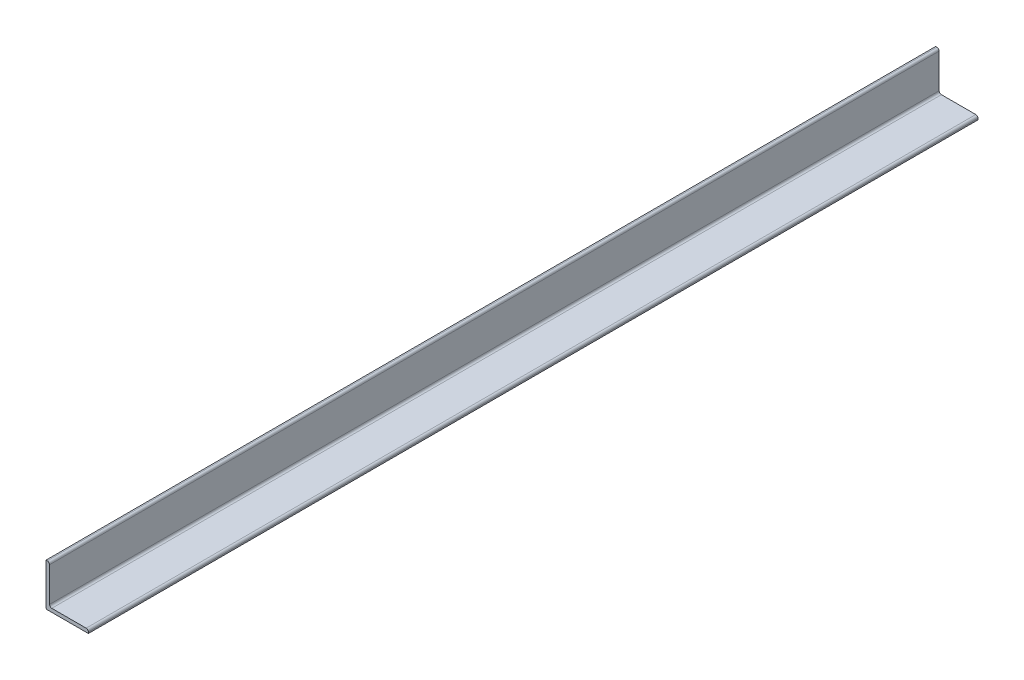
ISO-10303-21;
HEADER;
FILE_DESCRIPTION(('STEP AP214'),'2;1');
FILE_NAME('part.step','',(''),(''),'','','');
FILE_SCHEMA(('AUTOMOTIVE_DESIGN { 1 0 10303 214 1 1 1 1 }'));
ENDSEC;
DATA;
#1=APPLICATION_CONTEXT('core data for automotive mechanical design processes');
#2=APPLICATION_PROTOCOL_DEFINITION('international standard','automotive_design',2000,#1);
#3=PRODUCT_CONTEXT('',#1,'mechanical');
#4=PRODUCT('Part','Part','',(#3));
#5=PRODUCT_RELATED_PRODUCT_CATEGORY('part','',(#4));
#6=PRODUCT_DEFINITION_FORMATION('','',#4);
#7=PRODUCT_DEFINITION_CONTEXT('part definition',#1,'design');
#8=PRODUCT_DEFINITION('design','',#6,#7);
#9=PRODUCT_DEFINITION_SHAPE('','',#8);
#10=(LENGTH_UNIT() NAMED_UNIT(*) SI_UNIT(.MILLI.,.METRE.));
#11=(NAMED_UNIT(*) PLANE_ANGLE_UNIT() SI_UNIT($,.RADIAN.));
#12=(NAMED_UNIT(*) SI_UNIT($,.STERADIAN.) SOLID_ANGLE_UNIT());
#13=UNCERTAINTY_MEASURE_WITH_UNIT(LENGTH_MEASURE(1.E-05),#10,'distance_accuracy_value','');
#14=(GEOMETRIC_REPRESENTATION_CONTEXT(3) GLOBAL_UNCERTAINTY_ASSIGNED_CONTEXT((#13)) GLOBAL_UNIT_ASSIGNED_CONTEXT((#10,
#11,#12)) REPRESENTATION_CONTEXT('',''));
#15=CARTESIAN_POINT('',(0.,0.,0.));
#16=DIRECTION('',(0.,0.,1.));
#17=DIRECTION('',(1.,0.,0.));
#18=AXIS2_PLACEMENT_3D('',#15,#16,#17);
#19=CARTESIAN_POINT('',(19.05,0.,400.));
#20=DIRECTION('',(0.,1.,0.));
#21=DIRECTION('',(-1.,0.,0.));
#22=AXIS2_PLACEMENT_3D('',#19,#20,#21);
#23=PLANE('',#22);
#24=DIRECTION('',(1.,0.,0.));
#25=VECTOR('',#24,1.);
#26=CARTESIAN_POINT('',(19.05,0.,400.));
#27=LINE('',#26,#25);
#28=CARTESIAN_POINT('',(0.500000000000011,0.,400.));
#29=VERTEX_POINT('',#28);
#30=CARTESIAN_POINT('',(19.05,0.,400.));
#31=VERTEX_POINT('',#30);
#32=EDGE_CURVE('E109',#29,#31,#27,.T.);
#33=ORIENTED_EDGE('',*,*,#32,.F.);
#34=DIRECTION('',(0.,0.,-1.));
#35=VECTOR('',#34,1.);
#36=CARTESIAN_POINT('',(0.500000000000004,0.,400.));
#37=LINE('',#36,#35);
#38=CARTESIAN_POINT('',(0.500000000000011,0.,0.));
#39=VERTEX_POINT('',#38);
#40=EDGE_CURVE('E165',#29,#39,#37,.T.);
#41=ORIENTED_EDGE('',*,*,#40,.T.);
#42=DIRECTION('',(1.,0.,0.));
#43=VECTOR('',#42,1.);
#44=CARTESIAN_POINT('',(19.05,0.,0.));
#45=LINE('',#44,#43);
#46=CARTESIAN_POINT('',(19.05,0.,0.));
#47=VERTEX_POINT('',#46);
#48=EDGE_CURVE('E130',#39,#47,#45,.T.);
#49=ORIENTED_EDGE('',*,*,#48,.T.);
#50=DIRECTION('',(0.,0.,-1.));
#51=VECTOR('',#50,1.);
#52=CARTESIAN_POINT('',(19.05,0.,400.));
#53=LINE('',#52,#51);
#54=EDGE_CURVE('E125',#31,#47,#53,.T.);
#55=ORIENTED_EDGE('',*,*,#54,.F.);
#56=EDGE_LOOP('',(#33,#41,#49,#55));
#57=FACE_BOUND('',#56,.T.);
#58=ADVANCED_FACE('F32',(#57),#23,.F.);
#59=CARTESIAN_POINT('',(19.05,1.5875,400.));
#60=DIRECTION('',(-1.,0.,0.));
#61=DIRECTION('',(0.,0.,1.));
#62=AXIS2_PLACEMENT_3D('',#59,#60,#61);
#63=PLANE('',#62);
#64=DIRECTION('',(0.,1.,0.));
#65=VECTOR('',#64,1.);
#66=CARTESIAN_POINT('',(19.05,1.5875,0.));
#67=LINE('',#66,#65);
#68=CARTESIAN_POINT('',(19.05,0.5875,0.));
#69=VERTEX_POINT('',#68);
#70=EDGE_CURVE('E169',#47,#69,#67,.T.);
#71=ORIENTED_EDGE('',*,*,#70,.T.);
#72=DIRECTION('',(0.,0.,-1.));
#73=VECTOR('',#72,1.);
#74=CARTESIAN_POINT('',(19.05,0.5875,400.));
#75=LINE('',#74,#73);
#76=CARTESIAN_POINT('',(19.05,0.5875,400.));
#77=VERTEX_POINT('',#76);
#78=EDGE_CURVE('E127',#69,#77,#75,.F.);
#79=ORIENTED_EDGE('',*,*,#78,.T.);
#80=DIRECTION('',(0.,1.,0.));
#81=VECTOR('',#80,1.);
#82=CARTESIAN_POINT('',(19.05,1.5875,400.));
#83=LINE('',#82,#81);
#84=EDGE_CURVE('E112',#31,#77,#83,.T.);
#85=ORIENTED_EDGE('',*,*,#84,.F.);
#86=ORIENTED_EDGE('',*,*,#54,.T.);
#87=EDGE_LOOP('',(#71,#79,#85,#86));
#88=FACE_BOUND('',#87,.T.);
#89=ADVANCED_FACE('F124',(#88),#63,.F.);
#90=CARTESIAN_POINT('',(1.5875,1.5875,400.));
#91=DIRECTION('',(0.,-1.,0.));
#92=DIRECTION('',(0.,0.,-1.));
#93=AXIS2_PLACEMENT_3D('',#90,#91,#92);
#94=PLANE('',#93);
#95=DIRECTION('',(-1.,0.,0.));
#96=VECTOR('',#95,1.);
#97=CARTESIAN_POINT('',(1.5875,1.5875,400.));
#98=LINE('',#97,#96);
#99=CARTESIAN_POINT('',(18.05,1.5875,400.));
#100=VERTEX_POINT('',#99);
#101=CARTESIAN_POINT('',(2.5875,1.5875,400.));
#102=VERTEX_POINT('',#101);
#103=EDGE_CURVE('E128',#100,#102,#98,.T.);
#104=ORIENTED_EDGE('',*,*,#103,.F.);
#105=DIRECTION('',(0.,0.,-1.));
#106=VECTOR('',#105,1.);
#107=CARTESIAN_POINT('',(18.05,1.5875,400.));
#108=LINE('',#107,#106);
#109=CARTESIAN_POINT('',(18.05,1.5875,0.));
#110=VERTEX_POINT('',#109);
#111=EDGE_CURVE('E135',#100,#110,#108,.T.);
#112=ORIENTED_EDGE('',*,*,#111,.T.);
#113=DIRECTION('',(-1.,0.,0.));
#114=VECTOR('',#113,1.);
#115=CARTESIAN_POINT('',(1.5875,1.5875,0.));
#116=LINE('',#115,#114);
#117=CARTESIAN_POINT('',(2.5875,1.5875,0.));
#118=VERTEX_POINT('',#117);
#119=EDGE_CURVE('E171',#110,#118,#116,.T.);
#120=ORIENTED_EDGE('',*,*,#119,.T.);
#121=DIRECTION('',(0.,0.,-1.));
#122=VECTOR('',#121,1.);
#123=CARTESIAN_POINT('',(2.5875,1.5875,400.));
#124=LINE('',#123,#122);
#125=EDGE_CURVE('E132',#118,#102,#124,.F.);
#126=ORIENTED_EDGE('',*,*,#125,.T.);
#127=EDGE_LOOP('',(#104,#112,#120,#126));
#128=FACE_BOUND('',#127,.T.);
#129=ADVANCED_FACE('F197',(#128),#94,.F.);
#130=CARTESIAN_POINT('',(1.5875,19.05,400.));
#131=DIRECTION('',(-1.,0.,0.));
#132=DIRECTION('',(0.,-1.,0.));
#133=AXIS2_PLACEMENT_3D('',#130,#131,#132);
#134=PLANE('',#133);
#135=DIRECTION('',(0.,1.,0.));
#136=VECTOR('',#135,1.);
#137=CARTESIAN_POINT('',(1.5875,19.05,400.));
#138=LINE('',#137,#136);
#139=CARTESIAN_POINT('',(1.5875,2.5875,400.));
#140=VERTEX_POINT('',#139);
#141=CARTESIAN_POINT('',(1.5875,18.05,400.));
#142=VERTEX_POINT('',#141);
#143=EDGE_CURVE('E215',#140,#142,#138,.T.);
#144=ORIENTED_EDGE('',*,*,#143,.F.);
#145=DIRECTION('',(0.,0.,-1.));
#146=VECTOR('',#145,1.);
#147=CARTESIAN_POINT('',(1.5875,2.5875,0.));
#148=LINE('',#147,#146);
#149=CARTESIAN_POINT('',(1.5875,2.5875,0.));
#150=VERTEX_POINT('',#149);
#151=EDGE_CURVE('E155',#140,#150,#148,.T.);
#152=ORIENTED_EDGE('',*,*,#151,.T.);
#153=DIRECTION('',(0.,1.,0.));
#154=VECTOR('',#153,1.);
#155=CARTESIAN_POINT('',(1.5875,19.05,0.));
#156=LINE('',#155,#154);
#157=CARTESIAN_POINT('',(1.5875,18.05,0.));
#158=VERTEX_POINT('',#157);
#159=EDGE_CURVE('E178',#150,#158,#156,.T.);
#160=ORIENTED_EDGE('',*,*,#159,.T.);
#161=DIRECTION('',(0.,0.,-1.));
#162=VECTOR('',#161,1.);
#163=CARTESIAN_POINT('',(1.5875,18.05,400.));
#164=LINE('',#163,#162);
#165=EDGE_CURVE('E153',#158,#142,#164,.F.);
#166=ORIENTED_EDGE('',*,*,#165,.T.);
#167=EDGE_LOOP('',(#144,#152,#160,#166));
#168=FACE_BOUND('',#167,.T.);
#169=ADVANCED_FACE('F219',(#168),#134,.F.);
#170=CARTESIAN_POINT('',(0.,19.05,400.));
#171=DIRECTION('',(0.,-1.,0.));
#172=DIRECTION('',(0.,0.,-1.));
#173=AXIS2_PLACEMENT_3D('',#170,#171,#172);
#174=PLANE('',#173);
#175=DIRECTION('',(-1.,0.,0.));
#176=VECTOR('',#175,1.);
#177=CARTESIAN_POINT('',(0.,19.05,400.));
#178=LINE('',#177,#176);
#179=CARTESIAN_POINT('',(0.5875,19.05,400.));
#180=VERTEX_POINT('',#179);
#181=CARTESIAN_POINT('',(0.,19.05,400.));
#182=VERTEX_POINT('',#181);
#183=EDGE_CURVE('E222',#180,#182,#178,.T.);
#184=ORIENTED_EDGE('',*,*,#183,.F.);
#185=DIRECTION('',(0.,0.,-1.));
#186=VECTOR('',#185,1.);
#187=CARTESIAN_POINT('',(0.5875,19.05,400.));
#188=LINE('',#187,#186);
#189=CARTESIAN_POINT('',(0.5875,19.05,0.));
#190=VERTEX_POINT('',#189);
#191=EDGE_CURVE('E158',#180,#190,#188,.T.);
#192=ORIENTED_EDGE('',*,*,#191,.T.);
#193=DIRECTION('',(-1.,0.,0.));
#194=VECTOR('',#193,1.);
#195=CARTESIAN_POINT('',(0.,19.05,0.));
#196=LINE('',#195,#194);
#197=CARTESIAN_POINT('',(0.,19.05,0.));
#198=VERTEX_POINT('',#197);
#199=EDGE_CURVE('E181',#190,#198,#196,.T.);
#200=ORIENTED_EDGE('',*,*,#199,.T.);
#201=DIRECTION('',(0.,0.,-1.));
#202=VECTOR('',#201,1.);
#203=CARTESIAN_POINT('',(0.,19.05,400.));
#204=LINE('',#203,#202);
#205=EDGE_CURVE('E133',#182,#198,#204,.T.);
#206=ORIENTED_EDGE('',*,*,#205,.F.);
#207=EDGE_LOOP('',(#184,#192,#200,#206));
#208=FACE_BOUND('',#207,.T.);
#209=ADVANCED_FACE('F228',(#208),#174,.F.);
#210=CARTESIAN_POINT('',(0.,0.,400.));
#211=DIRECTION('',(1.,0.,0.));
#212=DIRECTION('',(0.,0.,-1.));
#213=AXIS2_PLACEMENT_3D('',#210,#211,#212);
#214=PLANE('',#213);
#215=DIRECTION('',(0.,-1.,0.));
#216=VECTOR('',#215,1.);
#217=CARTESIAN_POINT('',(0.,0.,0.));
#218=LINE('',#217,#216);
#219=CARTESIAN_POINT('',(0.,0.5,0.));
#220=VERTEX_POINT('',#219);
#221=EDGE_CURVE('E119',#198,#220,#218,.T.);
#222=ORIENTED_EDGE('',*,*,#221,.T.);
#223=DIRECTION('',(0.,0.,-1.));
#224=VECTOR('',#223,1.);
#225=CARTESIAN_POINT('',(0.,0.5,400.));
#226=LINE('',#225,#224);
#227=CARTESIAN_POINT('',(0.,0.5,400.));
#228=VERTEX_POINT('',#227);
#229=EDGE_CURVE('E40',#220,#228,#226,.F.);
#230=ORIENTED_EDGE('',*,*,#229,.T.);
#231=DIRECTION('',(0.,-1.,0.));
#232=VECTOR('',#231,1.);
#233=CARTESIAN_POINT('',(0.,0.,400.));
#234=LINE('',#233,#232);
#235=EDGE_CURVE('E138',#182,#228,#234,.T.);
#236=ORIENTED_EDGE('',*,*,#235,.F.);
#237=ORIENTED_EDGE('',*,*,#205,.T.);
#238=EDGE_LOOP('',(#222,#230,#236,#237));
#239=FACE_BOUND('',#238,.T.);
#240=ADVANCED_FACE('F182',(#239),#214,.F.);
#241=CARTESIAN_POINT('',(0.,0.,400.));
#242=DIRECTION('',(0.,0.,-1.));
#243=DIRECTION('',(-1.,0.,0.));
#244=AXIS2_PLACEMENT_3D('',#241,#242,#243);
#245=PLANE('',#244);
#246=ORIENTED_EDGE('',*,*,#235,.T.);
#247=CARTESIAN_POINT('',(0.500000000000004,0.5,400.));
#248=DIRECTION('',(0.,0.,-1.));
#249=DIRECTION('',(-1.,0.,0.));
#250=AXIS2_PLACEMENT_3D('',#247,#248,#249);
#251=CIRCLE('',#250,0.5);
#252=EDGE_CURVE('E11',#228,#29,#251,.F.);
#253=ORIENTED_EDGE('',*,*,#252,.T.);
#254=ORIENTED_EDGE('',*,*,#32,.T.);
#255=ORIENTED_EDGE('',*,*,#84,.T.);
#256=CARTESIAN_POINT('',(18.05,0.5875,400.));
#257=DIRECTION('',(0.,0.,-1.));
#258=DIRECTION('',(-1.,0.,0.));
#259=AXIS2_PLACEMENT_3D('',#256,#257,#258);
#260=CIRCLE('',#259,1.);
#261=EDGE_CURVE('E151',#77,#100,#260,.F.);
#262=ORIENTED_EDGE('',*,*,#261,.T.);
#263=ORIENTED_EDGE('',*,*,#103,.T.);
#264=CARTESIAN_POINT('',(2.5875,2.5875,400.));
#265=DIRECTION('',(0.,0.,-1.));
#266=DIRECTION('',(-1.,0.,0.));
#267=AXIS2_PLACEMENT_3D('',#264,#265,#266);
#268=CIRCLE('',#267,1.);
#269=EDGE_CURVE('E163',#102,#140,#268,.T.);
#270=ORIENTED_EDGE('',*,*,#269,.T.);
#271=ORIENTED_EDGE('',*,*,#143,.T.);
#272=CARTESIAN_POINT('',(0.5875,18.05,400.));
#273=DIRECTION('',(0.,0.,-1.));
#274=DIRECTION('',(-1.,0.,0.));
#275=AXIS2_PLACEMENT_3D('',#272,#273,#274);
#276=CIRCLE('',#275,1.);
#277=EDGE_CURVE('E149',#142,#180,#276,.F.);
#278=ORIENTED_EDGE('',*,*,#277,.T.);
#279=ORIENTED_EDGE('',*,*,#183,.T.);
#280=EDGE_LOOP('',(#246,#253,#254,#255,#262,#263,#270,#271,#278,#279));
#281=FACE_BOUND('',#280,.T.);
#282=ADVANCED_FACE('F111',(#281),#245,.F.);
#283=CARTESIAN_POINT('',(0.,0.,0.));
#284=DIRECTION('',(0.,0.,-1.));
#285=DIRECTION('',(-1.,0.,0.));
#286=AXIS2_PLACEMENT_3D('',#283,#284,#285);
#287=PLANE('',#286);
#288=ORIENTED_EDGE('',*,*,#48,.F.);
#289=CARTESIAN_POINT('',(0.500000000000004,0.5,0.));
#290=DIRECTION('',(0.,0.,-1.));
#291=DIRECTION('',(-1.,0.,0.));
#292=AXIS2_PLACEMENT_3D('',#289,#290,#291);
#293=CIRCLE('',#292,0.5);
#294=EDGE_CURVE('E54',#39,#220,#293,.T.);
#295=ORIENTED_EDGE('',*,*,#294,.T.);
#296=ORIENTED_EDGE('',*,*,#221,.F.);
#297=ORIENTED_EDGE('',*,*,#199,.F.);
#298=CARTESIAN_POINT('',(0.5875,18.05,0.));
#299=DIRECTION('',(0.,0.,-1.));
#300=DIRECTION('',(-1.,0.,0.));
#301=AXIS2_PLACEMENT_3D('',#298,#299,#300);
#302=CIRCLE('',#301,1.);
#303=EDGE_CURVE('E144',#190,#158,#302,.T.);
#304=ORIENTED_EDGE('',*,*,#303,.T.);
#305=ORIENTED_EDGE('',*,*,#159,.F.);
#306=CARTESIAN_POINT('',(2.5875,2.5875,0.));
#307=DIRECTION('',(0.,0.,-1.));
#308=DIRECTION('',(-1.,0.,0.));
#309=AXIS2_PLACEMENT_3D('',#306,#307,#308);
#310=CIRCLE('',#309,1.);
#311=EDGE_CURVE('E161',#150,#118,#310,.F.);
#312=ORIENTED_EDGE('',*,*,#311,.T.);
#313=ORIENTED_EDGE('',*,*,#119,.F.);
#314=CARTESIAN_POINT('',(18.05,0.5875,0.));
#315=DIRECTION('',(0.,0.,-1.));
#316=DIRECTION('',(-1.,0.,0.));
#317=AXIS2_PLACEMENT_3D('',#314,#315,#316);
#318=CIRCLE('',#317,1.);
#319=EDGE_CURVE('E146',#110,#69,#318,.T.);
#320=ORIENTED_EDGE('',*,*,#319,.T.);
#321=ORIENTED_EDGE('',*,*,#70,.F.);
#322=EDGE_LOOP('',(#288,#295,#296,#297,#304,#305,#312,#313,#320,#321));
#323=FACE_BOUND('',#322,.T.);
#324=ADVANCED_FACE('F168',(#323),#287,.T.);
#325=CARTESIAN_POINT('',(18.05,0.5875,400.));
#326=DIRECTION('',(0.,0.,-1.));
#327=DIRECTION('',(-1.,0.,0.));
#328=AXIS2_PLACEMENT_3D('',#325,#326,#327);
#329=CYLINDRICAL_SURFACE('',#328,1.);
#330=ORIENTED_EDGE('',*,*,#261,.F.);
#331=ORIENTED_EDGE('',*,*,#78,.F.);
#332=ORIENTED_EDGE('',*,*,#319,.F.);
#333=ORIENTED_EDGE('',*,*,#111,.F.);
#334=EDGE_LOOP('',(#330,#331,#332,#333));
#335=FACE_BOUND('',#334,.T.);
#336=ADVANCED_FACE('F201',(#335),#329,.T.);
#337=CARTESIAN_POINT('',(2.5875,2.5875,400.));
#338=DIRECTION('',(0.,0.,1.));
#339=DIRECTION('',(1.,0.,0.));
#340=AXIS2_PLACEMENT_3D('',#337,#338,#339);
#341=CYLINDRICAL_SURFACE('',#340,1.);
#342=ORIENTED_EDGE('',*,*,#269,.F.);
#343=ORIENTED_EDGE('',*,*,#125,.F.);
#344=ORIENTED_EDGE('',*,*,#311,.F.);
#345=ORIENTED_EDGE('',*,*,#151,.F.);
#346=EDGE_LOOP('',(#342,#343,#344,#345));
#347=FACE_BOUND('',#346,.T.);
#348=ADVANCED_FACE('F190',(#347),#341,.F.);
#349=CARTESIAN_POINT('',(0.5875,18.05,400.));
#350=DIRECTION('',(0.,0.,-1.));
#351=DIRECTION('',(-1.,0.,0.));
#352=AXIS2_PLACEMENT_3D('',#349,#350,#351);
#353=CYLINDRICAL_SURFACE('',#352,1.);
#354=ORIENTED_EDGE('',*,*,#277,.F.);
#355=ORIENTED_EDGE('',*,*,#165,.F.);
#356=ORIENTED_EDGE('',*,*,#303,.F.);
#357=ORIENTED_EDGE('',*,*,#191,.F.);
#358=EDGE_LOOP('',(#354,#355,#356,#357));
#359=FACE_BOUND('',#358,.T.);
#360=ADVANCED_FACE('F186',(#359),#353,.T.);
#361=CARTESIAN_POINT('',(0.500000000000004,0.5,400.));
#362=DIRECTION('',(0.,0.,-1.));
#363=DIRECTION('',(-1.,0.,0.));
#364=AXIS2_PLACEMENT_3D('',#361,#362,#363);
#365=CYLINDRICAL_SURFACE('',#364,0.5);
#366=ORIENTED_EDGE('',*,*,#252,.F.);
#367=ORIENTED_EDGE('',*,*,#229,.F.);
#368=ORIENTED_EDGE('',*,*,#294,.F.);
#369=ORIENTED_EDGE('',*,*,#40,.F.);
#370=EDGE_LOOP('',(#366,#367,#368,#369));
#371=FACE_BOUND('',#370,.T.);
#372=ADVANCED_FACE('F34',(#371),#365,.T.);
#373=CLOSED_SHELL('',(#58,#89,#129,#169,#209,#240,#282,#324,#336,#348,#360,#372));
#374=MANIFOLD_SOLID_BREP('B2',#373);
#375=ADVANCED_BREP_SHAPE_REPRESENTATION('',(#18,#374),#14);
#376=SHAPE_DEFINITION_REPRESENTATION(#9,#375);
ENDSEC;
END-ISO-10303-21;
